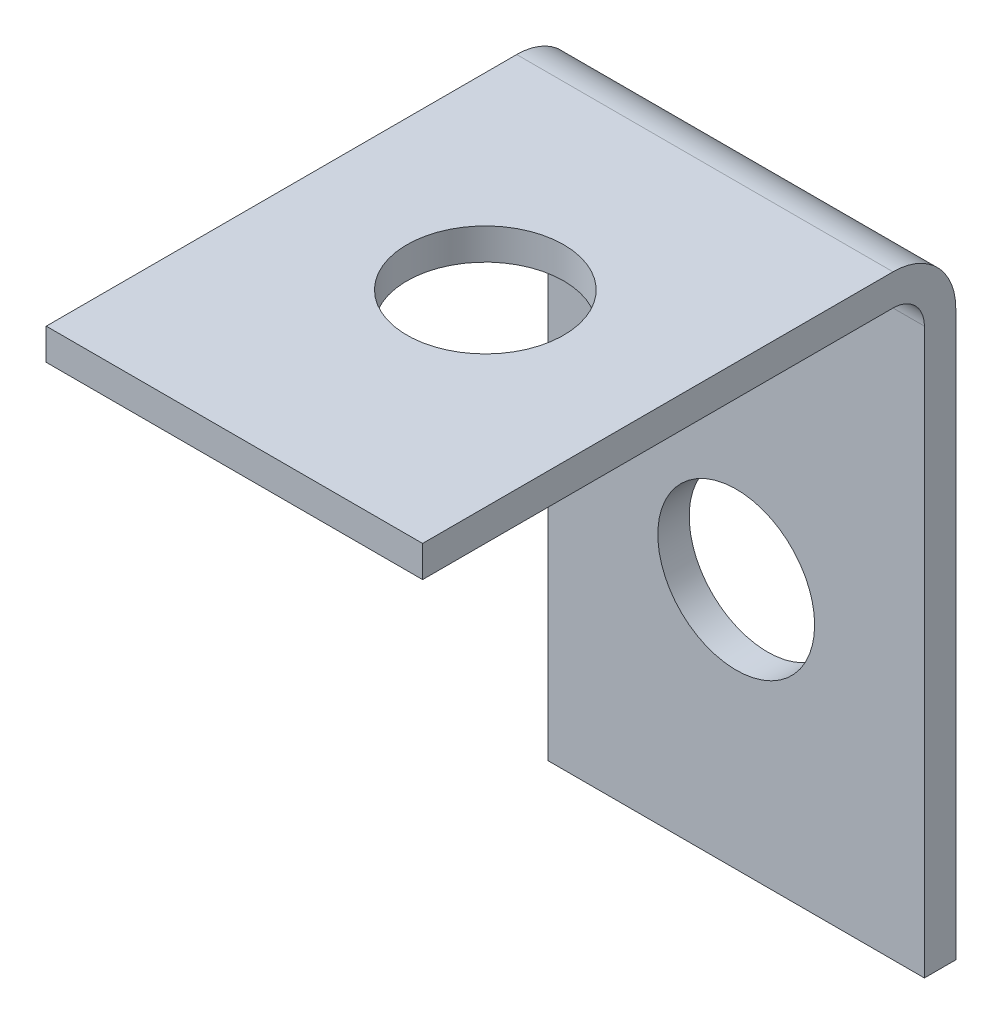
ISO-10303-21;
HEADER;
FILE_DESCRIPTION(('STEP AP214'),'2;1');
FILE_NAME('part.step','',(''),(''),'','','');
FILE_SCHEMA(('AUTOMOTIVE_DESIGN { 1 0 10303 214 1 1 1 1 }'));
ENDSEC;
DATA;
#1=APPLICATION_CONTEXT('core data for automotive mechanical design processes');
#2=APPLICATION_PROTOCOL_DEFINITION('international standard','automotive_design',2000,#1);
#3=PRODUCT_CONTEXT('',#1,'mechanical');
#4=PRODUCT('Part','Part','',(#3));
#5=PRODUCT_RELATED_PRODUCT_CATEGORY('part','',(#4));
#6=PRODUCT_DEFINITION_FORMATION('','',#4);
#7=PRODUCT_DEFINITION_CONTEXT('part definition',#1,'design');
#8=PRODUCT_DEFINITION('design','',#6,#7);
#9=PRODUCT_DEFINITION_SHAPE('','',#8);
#10=(LENGTH_UNIT() NAMED_UNIT(*) SI_UNIT(.MILLI.,.METRE.));
#11=(NAMED_UNIT(*) PLANE_ANGLE_UNIT() SI_UNIT($,.RADIAN.));
#12=(NAMED_UNIT(*) SI_UNIT($,.STERADIAN.) SOLID_ANGLE_UNIT());
#13=UNCERTAINTY_MEASURE_WITH_UNIT(LENGTH_MEASURE(1.E-05),#10,'distance_accuracy_value','');
#14=(GEOMETRIC_REPRESENTATION_CONTEXT(3) GLOBAL_UNCERTAINTY_ASSIGNED_CONTEXT((#13)) GLOBAL_UNIT_ASSIGNED_CONTEXT((#10,
#11,#12)) REPRESENTATION_CONTEXT('',''));
#15=CARTESIAN_POINT('',(0.,0.,0.));
#16=DIRECTION('',(0.,0.,1.));
#17=DIRECTION('',(1.,0.,0.));
#18=AXIS2_PLACEMENT_3D('',#15,#16,#17);
#19=CARTESIAN_POINT('',(6.,-2.,2.));
#20=DIRECTION('',(1.,0.,0.));
#21=DIRECTION('',(0.,0.,-1.));
#22=AXIS2_PLACEMENT_3D('',#19,#20,#21);
#23=CYLINDRICAL_SURFACE('',#22,2.);
#24=DIRECTION('',(-1.,0.,0.));
#25=VECTOR('',#24,1.);
#26=CARTESIAN_POINT('',(6.,0.,2.));
#27=LINE('',#26,#25);
#28=CARTESIAN_POINT('',(6.,0.,2.));
#29=VERTEX_POINT('',#28);
#30=CARTESIAN_POINT('',(-6.,0.,2.));
#31=VERTEX_POINT('',#30);
#32=EDGE_CURVE('E165',#29,#31,#27,.T.);
#33=ORIENTED_EDGE('',*,*,#32,.F.);
#34=CARTESIAN_POINT('',(6.,-2.,2.));
#35=DIRECTION('',(-1.,0.,0.));
#36=DIRECTION('',(0.,0.,1.));
#37=AXIS2_PLACEMENT_3D('',#34,#35,#36);
#38=CIRCLE('',#37,2.);
#39=CARTESIAN_POINT('',(6.,-2.,0.));
#40=VERTEX_POINT('',#39);
#41=EDGE_CURVE('E43',#40,#29,#38,.F.);
#42=ORIENTED_EDGE('',*,*,#41,.F.);
#43=DIRECTION('',(-1.,0.,0.));
#44=VECTOR('',#43,1.);
#45=CARTESIAN_POINT('',(6.,-2.,0.));
#46=LINE('',#45,#44);
#47=CARTESIAN_POINT('',(-6.,-2.,0.));
#48=VERTEX_POINT('',#47);
#49=EDGE_CURVE('E168',#48,#40,#46,.F.);
#50=ORIENTED_EDGE('',*,*,#49,.F.);
#51=CARTESIAN_POINT('',(-6.,-2.,2.));
#52=DIRECTION('',(1.,0.,0.));
#53=DIRECTION('',(0.,0.,-1.));
#54=AXIS2_PLACEMENT_3D('',#51,#52,#53);
#55=CIRCLE('',#54,2.);
#56=EDGE_CURVE('E11',#31,#48,#55,.F.);
#57=ORIENTED_EDGE('',*,*,#56,.F.);
#58=EDGE_LOOP('',(#33,#42,#50,#57));
#59=FACE_BOUND('',#58,.T.);
#60=ADVANCED_FACE('F36',(#59),#23,.T.);
#61=CARTESIAN_POINT('',(-6.,-2.,2.));
#62=DIRECTION('',(-1.,0.,0.));
#63=DIRECTION('',(0.,-1.,0.));
#64=AXIS2_PLACEMENT_3D('',#61,#62,#63);
#65=CYLINDRICAL_SURFACE('',#64,1.);
#66=DIRECTION('',(1.,0.,0.));
#67=VECTOR('',#66,1.);
#68=CARTESIAN_POINT('',(-6.,-1.,2.));
#69=LINE('',#68,#67);
#70=CARTESIAN_POINT('',(-6.,-1.,2.));
#71=VERTEX_POINT('',#70);
#72=CARTESIAN_POINT('',(6.,-1.,2.));
#73=VERTEX_POINT('',#72);
#74=EDGE_CURVE('E157',#71,#73,#69,.T.);
#75=ORIENTED_EDGE('',*,*,#74,.F.);
#76=CARTESIAN_POINT('',(-6.,-2.,2.));
#77=DIRECTION('',(1.,0.,0.));
#78=DIRECTION('',(0.,0.,-1.));
#79=AXIS2_PLACEMENT_3D('',#76,#77,#78);
#80=CIRCLE('',#79,1.);
#81=CARTESIAN_POINT('',(-6.,-2.,1.));
#82=VERTEX_POINT('',#81);
#83=EDGE_CURVE('E120',#71,#82,#80,.F.);
#84=ORIENTED_EDGE('',*,*,#83,.T.);
#85=DIRECTION('',(1.,0.,0.));
#86=VECTOR('',#85,1.);
#87=CARTESIAN_POINT('',(-6.,-2.,1.));
#88=LINE('',#87,#86);
#89=CARTESIAN_POINT('',(6.,-2.,1.));
#90=VERTEX_POINT('',#89);
#91=EDGE_CURVE('E159',#90,#82,#88,.F.);
#92=ORIENTED_EDGE('',*,*,#91,.F.);
#93=CARTESIAN_POINT('',(6.,-2.,2.));
#94=DIRECTION('',(-1.,0.,0.));
#95=DIRECTION('',(0.,0.,1.));
#96=AXIS2_PLACEMENT_3D('',#93,#94,#95);
#97=CIRCLE('',#96,1.);
#98=EDGE_CURVE('E163',#90,#73,#97,.F.);
#99=ORIENTED_EDGE('',*,*,#98,.T.);
#100=EDGE_LOOP('',(#75,#84,#92,#99));
#101=FACE_BOUND('',#100,.T.);
#102=ADVANCED_FACE('F197',(#101),#65,.F.);
#103=CARTESIAN_POINT('',(0.,0.,1.));
#104=DIRECTION('',(0.,0.,-1.));
#105=DIRECTION('',(-1.,0.,0.));
#106=AXIS2_PLACEMENT_3D('',#103,#104,#105);
#107=PLANE('',#106);
#108=CARTESIAN_POINT('',(0.,-12.,1.));
#109=DIRECTION('',(0.,0.,1.));
#110=DIRECTION('',(1.,0.,0.));
#111=AXIS2_PLACEMENT_3D('',#108,#109,#110);
#112=CIRCLE('',#111,2.5);
#113=CARTESIAN_POINT('',(2.5,-12.,1.));
#114=VERTEX_POINT('',#113);
#115=EDGE_CURVE('E125',#114,#114,#112,.T.);
#116=ORIENTED_EDGE('',*,*,#115,.F.);
#117=EDGE_LOOP('',(#116));
#118=FACE_BOUND('',#117,.T.);
#119=DIRECTION('',(0.,1.,0.));
#120=VECTOR('',#119,1.);
#121=CARTESIAN_POINT('',(6.,0.,1.));
#122=LINE('',#121,#120);
#123=CARTESIAN_POINT('',(6.,-20.,1.));
#124=VERTEX_POINT('',#123);
#125=EDGE_CURVE('E133',#124,#90,#122,.T.);
#126=ORIENTED_EDGE('',*,*,#125,.T.);
#127=ORIENTED_EDGE('',*,*,#91,.T.);
#128=DIRECTION('',(0.,-1.,0.));
#129=VECTOR('',#128,1.);
#130=CARTESIAN_POINT('',(-6.,0.,1.));
#131=LINE('',#130,#129);
#132=CARTESIAN_POINT('',(-6.,-20.,1.));
#133=VERTEX_POINT('',#132);
#134=EDGE_CURVE('E136',#82,#133,#131,.T.);
#135=ORIENTED_EDGE('',*,*,#134,.T.);
#136=DIRECTION('',(1.,0.,0.));
#137=VECTOR('',#136,1.);
#138=CARTESIAN_POINT('',(6.,-20.,1.));
#139=LINE('',#138,#137);
#140=EDGE_CURVE('E139',#133,#124,#139,.T.);
#141=ORIENTED_EDGE('',*,*,#140,.T.);
#142=EDGE_LOOP('',(#126,#127,#135,#141));
#143=FACE_BOUND('',#142,.T.);
#144=ADVANCED_FACE('F201',(#118,#143),#107,.F.);
#145=CARTESIAN_POINT('',(0.,0.,0.));
#146=DIRECTION('',(0.,0.,-1.));
#147=DIRECTION('',(-1.,0.,0.));
#148=AXIS2_PLACEMENT_3D('',#145,#146,#147);
#149=PLANE('',#148);
#150=DIRECTION('',(0.,-1.,0.));
#151=VECTOR('',#150,1.);
#152=CARTESIAN_POINT('',(-6.,0.,0.));
#153=LINE('',#152,#151);
#154=CARTESIAN_POINT('',(-6.,-20.,0.));
#155=VERTEX_POINT('',#154);
#156=EDGE_CURVE('E144',#48,#155,#153,.T.);
#157=ORIENTED_EDGE('',*,*,#156,.F.);
#158=ORIENTED_EDGE('',*,*,#49,.T.);
#159=DIRECTION('',(0.,1.,0.));
#160=VECTOR('',#159,1.);
#161=CARTESIAN_POINT('',(6.,0.,0.));
#162=LINE('',#161,#160);
#163=CARTESIAN_POINT('',(6.,-20.,0.));
#164=VERTEX_POINT('',#163);
#165=EDGE_CURVE('E131',#164,#40,#162,.T.);
#166=ORIENTED_EDGE('',*,*,#165,.F.);
#167=DIRECTION('',(1.,0.,0.));
#168=VECTOR('',#167,1.);
#169=CARTESIAN_POINT('',(6.,-20.,0.));
#170=LINE('',#169,#168);
#171=EDGE_CURVE('E137',#155,#164,#170,.T.);
#172=ORIENTED_EDGE('',*,*,#171,.F.);
#173=EDGE_LOOP('',(#157,#158,#166,#172));
#174=FACE_BOUND('',#173,.T.);
#175=CARTESIAN_POINT('',(0.,-12.,0.));
#176=DIRECTION('',(0.,0.,1.));
#177=DIRECTION('',(1.,0.,0.));
#178=AXIS2_PLACEMENT_3D('',#175,#176,#177);
#179=CIRCLE('',#178,2.5);
#180=CARTESIAN_POINT('',(2.5,-12.,0.));
#181=VERTEX_POINT('',#180);
#182=EDGE_CURVE('E122',#181,#181,#179,.T.);
#183=ORIENTED_EDGE('',*,*,#182,.T.);
#184=EDGE_LOOP('',(#183));
#185=FACE_BOUND('',#184,.T.);
#186=ADVANCED_FACE('F206',(#174,#185),#149,.T.);
#187=CARTESIAN_POINT('',(6.,0.,1.));
#188=DIRECTION('',(-1.,0.,0.));
#189=DIRECTION('',(0.,0.,1.));
#190=AXIS2_PLACEMENT_3D('',#187,#188,#189);
#191=PLANE('',#190);
#192=ORIENTED_EDGE('',*,*,#165,.T.);
#193=ORIENTED_EDGE('',*,*,#41,.T.);
#194=DIRECTION('',(0.,0.,-1.));
#195=VECTOR('',#194,1.);
#196=CARTESIAN_POINT('',(6.,0.,1.));
#197=LINE('',#196,#195);
#198=CARTESIAN_POINT('',(6.,0.,17.));
#199=VERTEX_POINT('',#198);
#200=EDGE_CURVE('E154',#199,#29,#197,.T.);
#201=ORIENTED_EDGE('',*,*,#200,.F.);
#202=DIRECTION('',(0.,1.,0.));
#203=VECTOR('',#202,1.);
#204=CARTESIAN_POINT('',(6.,0.,17.));
#205=LINE('',#204,#203);
#206=CARTESIAN_POINT('',(6.,-1.,17.));
#207=VERTEX_POINT('',#206);
#208=EDGE_CURVE('E108',#207,#199,#205,.T.);
#209=ORIENTED_EDGE('',*,*,#208,.F.);
#210=DIRECTION('',(0.,0.,-1.));
#211=VECTOR('',#210,1.);
#212=CARTESIAN_POINT('',(6.,-1.,17.));
#213=LINE('',#212,#211);
#214=EDGE_CURVE('E104',#207,#73,#213,.T.);
#215=ORIENTED_EDGE('',*,*,#214,.T.);
#216=ORIENTED_EDGE('',*,*,#98,.F.);
#217=ORIENTED_EDGE('',*,*,#125,.F.);
#218=DIRECTION('',(0.,0.,-1.));
#219=VECTOR('',#218,1.);
#220=CARTESIAN_POINT('',(6.,-20.,1.));
#221=LINE('',#220,#219);
#222=EDGE_CURVE('E141',#124,#164,#221,.T.);
#223=ORIENTED_EDGE('',*,*,#222,.T.);
#224=EDGE_LOOP('',(#192,#193,#201,#209,#215,#216,#217,#223));
#225=FACE_BOUND('',#224,.T.);
#226=ADVANCED_FACE('F170',(#225),#191,.F.);
#227=CARTESIAN_POINT('',(6.,0.,1.));
#228=DIRECTION('',(0.,-1.,0.));
#229=DIRECTION('',(0.,0.,-1.));
#230=AXIS2_PLACEMENT_3D('',#227,#228,#229);
#231=PLANE('',#230);
#232=CARTESIAN_POINT('',(0.,0.,9.));
#233=DIRECTION('',(0.,-1.,0.));
#234=DIRECTION('',(0.,0.,-1.));
#235=AXIS2_PLACEMENT_3D('',#232,#233,#234);
#236=CIRCLE('',#235,2.5);
#237=CARTESIAN_POINT('',(0.,0.,6.5));
#238=VERTEX_POINT('',#237);
#239=EDGE_CURVE('E116',#238,#238,#236,.T.);
#240=ORIENTED_EDGE('',*,*,#239,.T.);
#241=EDGE_LOOP('',(#240));
#242=FACE_BOUND('',#241,.T.);
#243=ORIENTED_EDGE('',*,*,#200,.T.);
#244=ORIENTED_EDGE('',*,*,#32,.T.);
#245=DIRECTION('',(0.,0.,-1.));
#246=VECTOR('',#245,1.);
#247=CARTESIAN_POINT('',(-6.,0.,1.));
#248=LINE('',#247,#246);
#249=CARTESIAN_POINT('',(-6.,0.,17.));
#250=VERTEX_POINT('',#249);
#251=EDGE_CURVE('E152',#250,#31,#248,.T.);
#252=ORIENTED_EDGE('',*,*,#251,.F.);
#253=DIRECTION('',(-1.,0.,0.));
#254=VECTOR('',#253,1.);
#255=CARTESIAN_POINT('',(-6.,0.,17.));
#256=LINE('',#255,#254);
#257=EDGE_CURVE('E115',#199,#250,#256,.T.);
#258=ORIENTED_EDGE('',*,*,#257,.F.);
#259=EDGE_LOOP('',(#243,#244,#252,#258));
#260=FACE_BOUND('',#259,.T.);
#261=ADVANCED_FACE('F173',(#242,#260),#231,.F.);
#262=CARTESIAN_POINT('',(-6.,0.,1.));
#263=DIRECTION('',(1.,0.,0.));
#264=DIRECTION('',(0.,0.,-1.));
#265=AXIS2_PLACEMENT_3D('',#262,#263,#264);
#266=PLANE('',#265);
#267=ORIENTED_EDGE('',*,*,#251,.T.);
#268=ORIENTED_EDGE('',*,*,#56,.T.);
#269=ORIENTED_EDGE('',*,*,#156,.T.);
#270=DIRECTION('',(0.,0.,-1.));
#271=VECTOR('',#270,1.);
#272=CARTESIAN_POINT('',(-6.,-20.,1.));
#273=LINE('',#272,#271);
#274=EDGE_CURVE('E149',#133,#155,#273,.T.);
#275=ORIENTED_EDGE('',*,*,#274,.F.);
#276=ORIENTED_EDGE('',*,*,#134,.F.);
#277=ORIENTED_EDGE('',*,*,#83,.F.);
#278=DIRECTION('',(0.,0.,-1.));
#279=VECTOR('',#278,1.);
#280=CARTESIAN_POINT('',(-6.,-1.,17.));
#281=LINE('',#280,#279);
#282=CARTESIAN_POINT('',(-6.,-1.,17.));
#283=VERTEX_POINT('',#282);
#284=EDGE_CURVE('E102',#283,#71,#281,.T.);
#285=ORIENTED_EDGE('',*,*,#284,.F.);
#286=DIRECTION('',(0.,-1.,0.));
#287=VECTOR('',#286,1.);
#288=CARTESIAN_POINT('',(-6.,0.,17.));
#289=LINE('',#288,#287);
#290=EDGE_CURVE('E109',#250,#283,#289,.T.);
#291=ORIENTED_EDGE('',*,*,#290,.F.);
#292=EDGE_LOOP('',(#267,#268,#269,#275,#276,#277,#285,#291));
#293=FACE_BOUND('',#292,.T.);
#294=ADVANCED_FACE('F118',(#293),#266,.F.);
#295=CARTESIAN_POINT('',(6.,-20.,1.));
#296=DIRECTION('',(0.,1.,0.));
#297=DIRECTION('',(0.,0.,1.));
#298=AXIS2_PLACEMENT_3D('',#295,#296,#297);
#299=PLANE('',#298);
#300=ORIENTED_EDGE('',*,*,#171,.T.);
#301=ORIENTED_EDGE('',*,*,#222,.F.);
#302=ORIENTED_EDGE('',*,*,#140,.F.);
#303=ORIENTED_EDGE('',*,*,#274,.T.);
#304=EDGE_LOOP('',(#300,#301,#302,#303));
#305=FACE_BOUND('',#304,.T.);
#306=ADVANCED_FACE('F193',(#305),#299,.F.);
#307=CARTESIAN_POINT('',(0.,-12.,1.));
#308=DIRECTION('',(0.,0.,-1.));
#309=DIRECTION('',(-1.,0.,0.));
#310=AXIS2_PLACEMENT_3D('',#307,#308,#309);
#311=CYLINDRICAL_SURFACE('',#310,2.5);
#312=ORIENTED_EDGE('',*,*,#115,.T.);
#313=EDGE_LOOP('',(#312));
#314=FACE_BOUND('',#313,.T.);
#315=ORIENTED_EDGE('',*,*,#182,.F.);
#316=EDGE_LOOP('',(#315));
#317=FACE_BOUND('',#316,.T.);
#318=ADVANCED_FACE('F186',(#314,#317),#311,.F.);
#319=CARTESIAN_POINT('',(-6.,-1.,17.));
#320=DIRECTION('',(0.,1.,0.));
#321=DIRECTION('',(-1.,0.,0.));
#322=AXIS2_PLACEMENT_3D('',#319,#320,#321);
#323=PLANE('',#322);
#324=CARTESIAN_POINT('',(0.,-1.,9.));
#325=DIRECTION('',(0.,-1.,0.));
#326=DIRECTION('',(0.,0.,-1.));
#327=AXIS2_PLACEMENT_3D('',#324,#325,#326);
#328=CIRCLE('',#327,2.5);
#329=CARTESIAN_POINT('',(0.,-1.,6.5));
#330=VERTEX_POINT('',#329);
#331=EDGE_CURVE('E178',#330,#330,#328,.T.);
#332=ORIENTED_EDGE('',*,*,#331,.F.);
#333=EDGE_LOOP('',(#332));
#334=FACE_BOUND('',#333,.T.);
#335=ORIENTED_EDGE('',*,*,#284,.T.);
#336=ORIENTED_EDGE('',*,*,#74,.T.);
#337=ORIENTED_EDGE('',*,*,#214,.F.);
#338=DIRECTION('',(1.,0.,0.));
#339=VECTOR('',#338,1.);
#340=CARTESIAN_POINT('',(-6.,-1.,17.));
#341=LINE('',#340,#339);
#342=EDGE_CURVE('E97',#283,#207,#341,.T.);
#343=ORIENTED_EDGE('',*,*,#342,.F.);
#344=EDGE_LOOP('',(#335,#336,#337,#343));
#345=FACE_BOUND('',#344,.T.);
#346=ADVANCED_FACE('F99',(#334,#345),#323,.F.);
#347=CARTESIAN_POINT('',(0.,0.,17.));
#348=DIRECTION('',(0.,0.,1.));
#349=DIRECTION('',(1.,0.,0.));
#350=AXIS2_PLACEMENT_3D('',#347,#348,#349);
#351=PLANE('',#350);
#352=ORIENTED_EDGE('',*,*,#290,.T.);
#353=ORIENTED_EDGE('',*,*,#342,.T.);
#354=ORIENTED_EDGE('',*,*,#208,.T.);
#355=ORIENTED_EDGE('',*,*,#257,.T.);
#356=EDGE_LOOP('',(#352,#353,#354,#355));
#357=FACE_BOUND('',#356,.T.);
#358=ADVANCED_FACE('F113',(#357),#351,.T.);
#359=CARTESIAN_POINT('',(0.,7.,9.));
#360=DIRECTION('',(0.,-1.,0.));
#361=DIRECTION('',(0.,0.,-1.));
#362=AXIS2_PLACEMENT_3D('',#359,#360,#361);
#363=CYLINDRICAL_SURFACE('',#362,2.5);
#364=ORIENTED_EDGE('',*,*,#331,.T.);
#365=EDGE_LOOP('',(#364));
#366=FACE_BOUND('',#365,.T.);
#367=ORIENTED_EDGE('',*,*,#239,.F.);
#368=EDGE_LOOP('',(#367));
#369=FACE_BOUND('',#368,.T.);
#370=ADVANCED_FACE('F182',(#366,#369),#363,.F.);
#371=CLOSED_SHELL('',(#60,#102,#144,#186,#226,#261,#294,#306,#318,#346,#358,#370));
#372=MANIFOLD_SOLID_BREP('B2',#371);
#373=ADVANCED_BREP_SHAPE_REPRESENTATION('',(#18,#372),#14);
#374=SHAPE_DEFINITION_REPRESENTATION(#9,#373);
ENDSEC;
END-ISO-10303-21;
